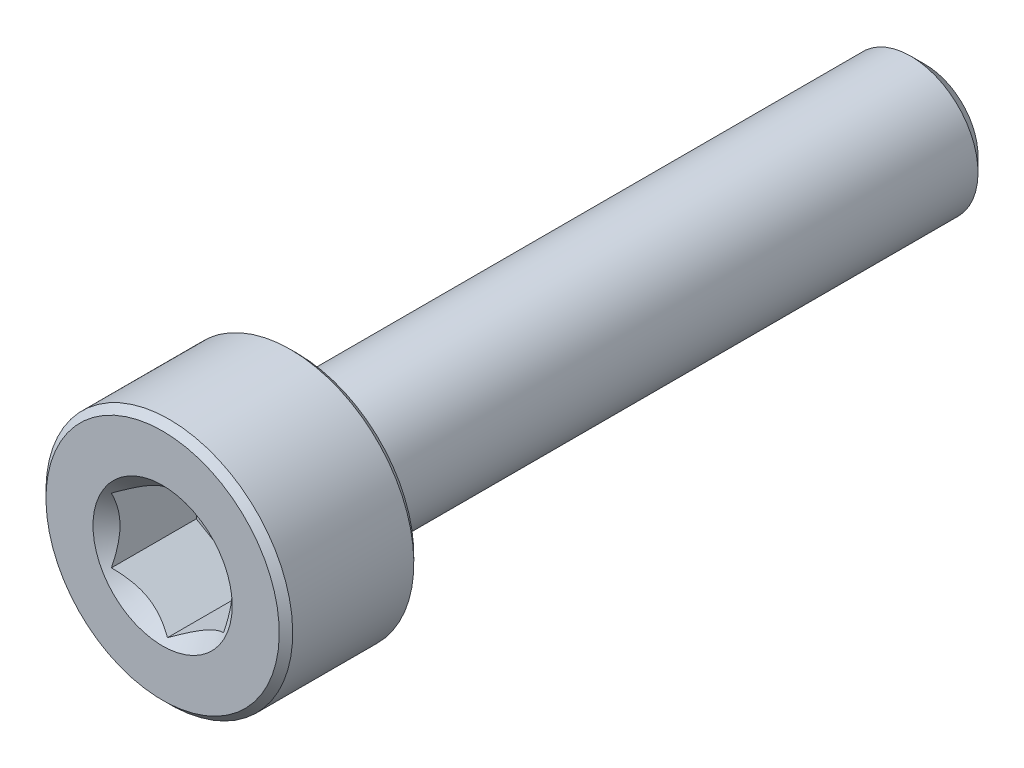
ISO-10303-21;
HEADER;
FILE_DESCRIPTION(('STEP AP214'),'2;1');
FILE_NAME('part.step','',(''),(''),'','','');
FILE_SCHEMA(('AUTOMOTIVE_DESIGN { 1 0 10303 214 1 1 1 1 }'));
ENDSEC;
DATA;
#1=APPLICATION_CONTEXT('core data for automotive mechanical design processes');
#2=APPLICATION_PROTOCOL_DEFINITION('international standard','automotive_design',2000,#1);
#3=PRODUCT_CONTEXT('',#1,'mechanical');
#4=PRODUCT('Part','Part','',(#3));
#5=PRODUCT_RELATED_PRODUCT_CATEGORY('part','',(#4));
#6=PRODUCT_DEFINITION_FORMATION('','',#4);
#7=PRODUCT_DEFINITION_CONTEXT('part definition',#1,'design');
#8=PRODUCT_DEFINITION('design','',#6,#7);
#9=PRODUCT_DEFINITION_SHAPE('','',#8);
#10=(LENGTH_UNIT() NAMED_UNIT(*) SI_UNIT(.MILLI.,.METRE.));
#11=(NAMED_UNIT(*) PLANE_ANGLE_UNIT() SI_UNIT($,.RADIAN.));
#12=(NAMED_UNIT(*) SI_UNIT($,.STERADIAN.) SOLID_ANGLE_UNIT());
#13=UNCERTAINTY_MEASURE_WITH_UNIT(LENGTH_MEASURE(1.E-05),#10,'distance_accuracy_value','');
#14=(GEOMETRIC_REPRESENTATION_CONTEXT(3) GLOBAL_UNCERTAINTY_ASSIGNED_CONTEXT((#13)) GLOBAL_UNIT_ASSIGNED_CONTEXT((#10,
#11,#12)) REPRESENTATION_CONTEXT('',''));
#15=CARTESIAN_POINT('',(0.,0.,0.));
#16=DIRECTION('',(0.,0.,1.));
#17=DIRECTION('',(1.,0.,0.));
#18=AXIS2_PLACEMENT_3D('',#15,#16,#17);
#19=CARTESIAN_POINT('',(0.,1.17524047358084,-8.5));
#20=DIRECTION('',(0.,0.,-1.));
#21=DIRECTION('',(0.,1.,0.));
#22=AXIS2_PLACEMENT_3D('',#19,#20,#21);
#23=PLANE('',#22);
#24=CARTESIAN_POINT('',(0.,0.,-8.5));
#25=DIRECTION('',(0.,0.,-1.));
#26=DIRECTION('',(0.,1.,0.));
#27=AXIS2_PLACEMENT_3D('',#24,#25,#26);
#28=CIRCLE('',#27,1.17524047358084);
#29=CARTESIAN_POINT('',(0.,1.17524047358084,-8.5));
#30=VERTEX_POINT('',#29);
#31=EDGE_CURVE('E54',#30,#30,#28,.T.);
#32=ORIENTED_EDGE('',*,*,#31,.T.);
#33=EDGE_LOOP('',(#32));
#34=FACE_BOUND('',#33,.T.);
#35=ADVANCED_FACE('F41',(#34),#23,.T.);
#36=CARTESIAN_POINT('',(0.,0.,-8.5));
#37=DIRECTION('',(0.,0.,1.));
#38=DIRECTION('',(0.,-1.,0.));
#39=AXIS2_PLACEMENT_3D('',#36,#37,#38);
#40=CONICAL_SURFACE('',#39,1.17524047358084,0.785398163397446);
#41=CARTESIAN_POINT('',(0.,0.,-8.17524047358083));
#42=DIRECTION('',(0.,0.,-1.));
#43=DIRECTION('',(0.,1.,0.));
#44=AXIS2_PLACEMENT_3D('',#41,#42,#43);
#45=CIRCLE('',#44,1.5);
#46=CARTESIAN_POINT('',(0.,1.5,-8.17524047358083));
#47=VERTEX_POINT('',#46);
#48=EDGE_CURVE('E157',#47,#47,#45,.T.);
#49=ORIENTED_EDGE('',*,*,#48,.T.);
#50=EDGE_LOOP('',(#49));
#51=FACE_BOUND('',#50,.T.);
#52=ORIENTED_EDGE('',*,*,#31,.F.);
#53=EDGE_LOOP('',(#52));
#54=FACE_BOUND('',#53,.T.);
#55=ADVANCED_FACE('F163',(#51,#54),#40,.T.);
#56=CARTESIAN_POINT('',(0.,0.,-8.5));
#57=DIRECTION('',(0.,0.,-1.));
#58=DIRECTION('',(0.,1.,0.));
#59=AXIS2_PLACEMENT_3D('',#56,#57,#58);
#60=CYLINDRICAL_SURFACE('',#59,1.5);
#61=CARTESIAN_POINT('',(0.,0.,5.35));
#62=DIRECTION('',(0.,0.,-1.));
#63=DIRECTION('',(0.,1.,0.));
#64=AXIS2_PLACEMENT_3D('',#61,#62,#63);
#65=CIRCLE('',#64,1.5);
#66=CARTESIAN_POINT('',(0.,1.5,5.35));
#67=VERTEX_POINT('',#66);
#68=EDGE_CURVE('E154',#67,#67,#65,.T.);
#69=ORIENTED_EDGE('',*,*,#68,.T.);
#70=EDGE_LOOP('',(#69));
#71=FACE_BOUND('',#70,.T.);
#72=ORIENTED_EDGE('',*,*,#48,.F.);
#73=EDGE_LOOP('',(#72));
#74=FACE_BOUND('',#73,.T.);
#75=ADVANCED_FACE('F165',(#71,#74),#60,.T.);
#76=CARTESIAN_POINT('',(0.,0.,5.35));
#77=DIRECTION('',(0.,0.,-1.));
#78=DIRECTION('',(0.,1.,0.));
#79=AXIS2_PLACEMENT_3D('',#76,#77,#78);
#80=TOROIDAL_SURFACE('',#79,1.65,0.15);
#81=CARTESIAN_POINT('',(0.,0.,5.5));
#82=DIRECTION('',(0.,0.,-1.));
#83=DIRECTION('',(0.,1.,0.));
#84=AXIS2_PLACEMENT_3D('',#81,#82,#83);
#85=CIRCLE('',#84,1.65);
#86=CARTESIAN_POINT('',(0.,1.65,5.5));
#87=VERTEX_POINT('',#86);
#88=EDGE_CURVE('E151',#87,#87,#85,.T.);
#89=ORIENTED_EDGE('',*,*,#88,.T.);
#90=EDGE_LOOP('',(#89));
#91=FACE_BOUND('',#90,.T.);
#92=ORIENTED_EDGE('',*,*,#68,.F.);
#93=EDGE_LOOP('',(#92));
#94=FACE_BOUND('',#93,.T.);
#95=ADVANCED_FACE('F171',(#91,#94),#80,.F.);
#96=CARTESIAN_POINT('',(0.,2.6,5.5));
#97=DIRECTION('',(0.,0.,-1.));
#98=DIRECTION('',(0.,1.,0.));
#99=AXIS2_PLACEMENT_3D('',#96,#97,#98);
#100=PLANE('',#99);
#101=CARTESIAN_POINT('',(0.,0.,5.5));
#102=DIRECTION('',(0.,0.,-1.));
#103=DIRECTION('',(0.,1.,0.));
#104=AXIS2_PLACEMENT_3D('',#101,#102,#103);
#105=CIRCLE('',#104,2.6);
#106=CARTESIAN_POINT('',(0.,2.6,5.5));
#107=VERTEX_POINT('',#106);
#108=EDGE_CURVE('E148',#107,#107,#105,.T.);
#109=ORIENTED_EDGE('',*,*,#108,.T.);
#110=EDGE_LOOP('',(#109));
#111=FACE_BOUND('',#110,.T.);
#112=ORIENTED_EDGE('',*,*,#88,.F.);
#113=EDGE_LOOP('',(#112));
#114=FACE_BOUND('',#113,.T.);
#115=ADVANCED_FACE('F177',(#111,#114),#100,.T.);
#116=CARTESIAN_POINT('',(0.,0.,5.5));
#117=DIRECTION('',(0.,0.,1.));
#118=DIRECTION('',(0.,-1.,0.));
#119=AXIS2_PLACEMENT_3D('',#116,#117,#118);
#120=CONICAL_SURFACE('',#119,2.6,0.785398163397451);
#121=CARTESIAN_POINT('',(0.,0.,5.65));
#122=DIRECTION('',(0.,0.,-1.));
#123=DIRECTION('',(0.,1.,0.));
#124=AXIS2_PLACEMENT_3D('',#121,#122,#123);
#125=CIRCLE('',#124,2.75);
#126=CARTESIAN_POINT('',(0.,2.75,5.65));
#127=VERTEX_POINT('',#126);
#128=EDGE_CURVE('E145',#127,#127,#125,.T.);
#129=ORIENTED_EDGE('',*,*,#128,.T.);
#130=EDGE_LOOP('',(#129));
#131=FACE_BOUND('',#130,.T.);
#132=ORIENTED_EDGE('',*,*,#108,.F.);
#133=EDGE_LOOP('',(#132));
#134=FACE_BOUND('',#133,.T.);
#135=ADVANCED_FACE('F181',(#131,#134),#120,.T.);
#136=CARTESIAN_POINT('',(0.,0.,-8.5));
#137=DIRECTION('',(0.,0.,-1.));
#138=DIRECTION('',(0.,1.,0.));
#139=AXIS2_PLACEMENT_3D('',#136,#137,#138);
#140=CYLINDRICAL_SURFACE('',#139,2.75);
#141=CARTESIAN_POINT('',(0.,0.,8.35));
#142=DIRECTION('',(0.,0.,-1.));
#143=DIRECTION('',(0.,1.,0.));
#144=AXIS2_PLACEMENT_3D('',#141,#142,#143);
#145=CIRCLE('',#144,2.75);
#146=CARTESIAN_POINT('',(0.,2.75,8.35));
#147=VERTEX_POINT('',#146);
#148=EDGE_CURVE('E142',#147,#147,#145,.T.);
#149=ORIENTED_EDGE('',*,*,#148,.T.);
#150=EDGE_LOOP('',(#149));
#151=FACE_BOUND('',#150,.T.);
#152=ORIENTED_EDGE('',*,*,#128,.F.);
#153=EDGE_LOOP('',(#152));
#154=FACE_BOUND('',#153,.T.);
#155=ADVANCED_FACE('F185',(#151,#154),#140,.T.);
#156=CARTESIAN_POINT('',(0.,0.,8.35));
#157=DIRECTION('',(0.,0.,-1.));
#158=DIRECTION('',(0.,1.,0.));
#159=AXIS2_PLACEMENT_3D('',#156,#157,#158);
#160=CONICAL_SURFACE('',#159,2.75,0.785398163397445);
#161=CARTESIAN_POINT('',(0.,0.,8.5));
#162=DIRECTION('',(0.,0.,-1.));
#163=DIRECTION('',(0.,1.,0.));
#164=AXIS2_PLACEMENT_3D('',#161,#162,#163);
#165=CIRCLE('',#164,2.6);
#166=CARTESIAN_POINT('',(0.,2.6,8.5));
#167=VERTEX_POINT('',#166);
#168=EDGE_CURVE('E139',#167,#167,#165,.T.);
#169=ORIENTED_EDGE('',*,*,#168,.T.);
#170=EDGE_LOOP('',(#169));
#171=FACE_BOUND('',#170,.T.);
#172=ORIENTED_EDGE('',*,*,#148,.F.);
#173=EDGE_LOOP('',(#172));
#174=FACE_BOUND('',#173,.T.);
#175=ADVANCED_FACE('F189',(#171,#174),#160,.T.);
#176=CARTESIAN_POINT('',(0.,0.,8.5));
#177=DIRECTION('',(0.,0.,1.));
#178=DIRECTION('',(0.,-1.,0.));
#179=AXIS2_PLACEMENT_3D('',#176,#177,#178);
#180=PLANE('',#179);
#181=CARTESIAN_POINT('',(0.,0.,8.5));
#182=DIRECTION('',(0.,0.,1.));
#183=DIRECTION('',(1.,0.,0.));
#184=AXIS2_PLACEMENT_3D('',#181,#182,#183);
#185=CIRCLE('',#184,1.55162884844712);
#186=CARTESIAN_POINT('',(1.55162884844712,0.,8.5));
#187=VERTEX_POINT('',#186);
#188=EDGE_CURVE('E113',#187,#187,#185,.T.);
#189=ORIENTED_EDGE('',*,*,#188,.F.);
#190=EDGE_LOOP('',(#189));
#191=FACE_BOUND('',#190,.T.);
#192=ORIENTED_EDGE('',*,*,#168,.F.);
#193=EDGE_LOOP('',(#192));
#194=FACE_BOUND('',#193,.T.);
#195=ADVANCED_FACE('F193',(#191,#194),#180,.T.);
#196=CARTESIAN_POINT('',(0.,0.,8.5));
#197=DIRECTION('',(0.,0.,1.));
#198=DIRECTION('',(1.,0.,0.));
#199=AXIS2_PLACEMENT_3D('',#196,#197,#198);
#200=CONICAL_SURFACE('',#199,1.55162884844712,0.78539816339745);
#201=ORIENTED_EDGE('',*,*,#188,.T.);
#202=EDGE_LOOP('',(#201));
#203=FACE_BOUND('',#202,.T.);
#204=CARTESIAN_POINT('',(-0.000199999999999042,-1.4434911430279,8.39186230843608));
#205=CARTESIAN_POINT('',(0.0427751670715875,-1.41867941875065,8.36706849258205));
#206=CARTESIAN_POINT('',(0.0864690047459489,-1.39345276980743,8.34373055894563));
#207=CARTESIAN_POINT('',(0.175565930841943,-1.34201263554194,8.30099882861148));
#208=CARTESIAN_POINT('',(0.220977498357065,-1.31579425481276,8.28162881688736));
#209=CARTESIAN_POINT('',(0.312547820935262,-1.26292610442246,8.24844730794042));
#210=CARTESIAN_POINT('',(0.358683240175887,-1.23628980770471,8.2345523835796));
#211=CARTESIAN_POINT('',(0.451970080407594,-1.18243062538508,8.21314410668758));
#212=CARTESIAN_POINT('',(0.499118649136382,-1.15520938653761,8.20561476609373));
#213=CARTESIAN_POINT('',(0.580373556887254,-1.10829684367467,8.19882132257765));
#214=CARTESIAN_POINT('',(0.614374876627943,-1.08866617256958,8.1978153836313));
#215=CARTESIAN_POINT('',(0.68231776443248,-1.04943932800611,8.19950823943827));
#216=CARTESIAN_POINT('',(0.71625931765566,-1.02984316311599,8.20220785174249));
#217=CARTESIAN_POINT('',(0.783814856457502,-0.990839954603498,8.21115575484333));
#218=CARTESIAN_POINT('',(0.817428507286777,-0.97143310424877,8.21740735042665));
#219=CARTESIAN_POINT('',(0.884094638217815,-0.932943395609904,8.23312250594085));
#220=CARTESIAN_POINT('',(0.917146871030298,-0.913860680098299,8.24258744461441));
#221=CARTESIAN_POINT('',(1.00179969160027,-0.864986351354567,8.27067821521453));
#222=CARTESIAN_POINT('',(1.05286649242964,-0.835502920149075,8.29141698197915));
#223=CARTESIAN_POINT('',(1.15300085411326,-0.777690319475908,8.33813395919842));
#224=CARTESIAN_POINT('',(1.20207431157827,-0.749357745598417,8.36409512047371));
#225=CARTESIAN_POINT('',(1.2502,-0.721572366433194,8.39186230843608));
#226=B_SPLINE_CURVE_WITH_KNOTS('',3,(#204,#205,#206,#207,#208,#209,#210,#211,#212,#213,#214,
#215,#216,#217,#218,#219,#220,#221,#222,#223,#224,#225),.UNSPECIFIED.,.F.,.F.,(4,2,2,2,2,2,2,2,
2,2,4),(0.,0.166533409618304,0.334037607289762,0.498880396489699,0.663307919240276,
0.780963963458828,0.898645970148455,1.01643764860773,1.1342799317155,1.32148652032141,
1.50809158792573),.UNSPECIFIED.);
#227=CARTESIAN_POINT('',(0.,-1.44337567297406,8.39174682452695));
#228=VERTEX_POINT('',#227);
#229=CARTESIAN_POINT('',(1.25,-0.721687836487032,8.39174682452695));
#230=VERTEX_POINT('',#229);
#231=EDGE_CURVE('E12',#228,#230,#226,.T.);
#232=ORIENTED_EDGE('',*,*,#231,.F.);
#233=CARTESIAN_POINT('',(-1.2502,-0.721572366433195,8.39186230843608));
#234=CARTESIAN_POINT('',(-1.20722483292841,-0.746384090710444,8.36706849258205));
#235=CARTESIAN_POINT('',(-1.16353099525405,-0.771610739653665,8.34373055894563));
#236=CARTESIAN_POINT('',(-1.07443406915806,-0.823050873919155,8.30099882861148));
#237=CARTESIAN_POINT('',(-1.02902250164294,-0.849269254648334,8.28162881688736));
#238=CARTESIAN_POINT('',(-0.937452179064739,-0.902137405038636,8.24844730794042));
#239=CARTESIAN_POINT('',(-0.891316759824113,-0.928773701756388,8.2345523835796));
#240=CARTESIAN_POINT('',(-0.798029919592406,-0.982632884076013,8.21314410668758));
#241=CARTESIAN_POINT('',(-0.750881350863618,-1.00985412292348,8.20561476609373));
#242=CARTESIAN_POINT('',(-0.669626443112746,-1.05676666578643,8.19882132257765));
#243=CARTESIAN_POINT('',(-0.635625123372057,-1.07639733689152,8.1978153836313));
#244=CARTESIAN_POINT('',(-0.567682235567521,-1.11562418145499,8.19950823943827));
#245=CARTESIAN_POINT('',(-0.53374068234434,-1.1352203463451,8.20220785174248));
#246=CARTESIAN_POINT('',(-0.466185143542498,-1.1742235548576,8.21115575484332));
#247=CARTESIAN_POINT('',(-0.432571492713223,-1.19363040521233,8.21740735042665));
#248=CARTESIAN_POINT('',(-0.365905361782185,-1.23212011385119,8.23312250594085));
#249=CARTESIAN_POINT('',(-0.332853128969702,-1.2512028293628,8.24258744461441));
#250=CARTESIAN_POINT('',(-0.248200308399734,-1.30007715810653,8.27067821521453));
#251=CARTESIAN_POINT('',(-0.19713350757036,-1.32956058931202,8.29141698197915));
#252=CARTESIAN_POINT('',(-0.0969991458867441,-1.38737318998519,8.33813395919842));
#253=CARTESIAN_POINT('',(-0.0479256884217298,-1.41570576386268,8.36409512047371));
#254=CARTESIAN_POINT('',(0.000200000000000625,-1.4434911430279,8.39186230843608));
#255=B_SPLINE_CURVE_WITH_KNOTS('',3,(#233,#234,#235,#236,#237,#238,#239,#240,#241,#242,#243,
#244,#245,#246,#247,#248,#249,#250,#251,#252,#253,#254),.UNSPECIFIED.,.F.,.F.,(4,2,2,2,2,2,2,2,
2,2,4),(0.,0.166533409618304,0.334037607289762,0.498880396489699,0.663307919240276,
0.780963963458829,0.898645970148455,1.01643764860773,1.1342799317155,1.32148652032141,
1.50809158792574),.UNSPECIFIED.);
#256=CARTESIAN_POINT('',(-1.25,-0.721687836487032,8.39174682452695));
#257=VERTEX_POINT('',#256);
#258=EDGE_CURVE('E99',#257,#228,#255,.T.);
#259=ORIENTED_EDGE('',*,*,#258,.F.);
#260=CARTESIAN_POINT('',(-1.25,-1.52022146239345,8.91651070319084));
#261=CARTESIAN_POINT('',(-1.25,-1.48354689134962,8.88818689718723));
#262=CARTESIAN_POINT('',(-1.25,-1.44667707589305,8.86011672093047));
#263=CARTESIAN_POINT('',(-1.25,-1.37246477804769,8.80459065501776));
#264=CARTESIAN_POINT('',(-1.25,-1.33512218721453,8.77713491044788));
#265=CARTESIAN_POINT('',(-1.25,-1.22171630832114,8.6954580977105));
#266=CARTESIAN_POINT('',(-1.25,-1.14482995781092,8.6423614251193));
#267=CARTESIAN_POINT('',(-1.25,-0.983056768942586,8.53734973416941));
#268=CARTESIAN_POINT('',(-1.25,-0.897974111811055,8.48573326925832));
#269=CARTESIAN_POINT('',(-1.25,-0.723462355215555,8.39078355108508));
#270=CARTESIAN_POINT('',(-1.25,-0.634049271919705,8.34742232185916));
#271=CARTESIAN_POINT('',(-1.25,-0.500588771143699,8.29435177040724));
#272=CARTESIAN_POINT('',(-1.25,-0.45869172620811,8.27926501327173));
#273=CARTESIAN_POINT('',(-1.25,-0.373815329706778,8.25244749770266));
#274=CARTESIAN_POINT('',(-1.25,-0.330835910419723,8.24071694982871));
#275=CARTESIAN_POINT('',(-1.25,-0.244810833071148,8.22144313304601));
#276=CARTESIAN_POINT('',(-1.25,-0.20178270746757,8.21382289169454));
#277=CARTESIAN_POINT('',(-1.25,-0.115176247984995,8.20293190707963));
#278=CARTESIAN_POINT('',(-1.25,-0.0715980347745597,8.1996602260857));
#279=CARTESIAN_POINT('',(-1.25,0.0136806197531965,8.19775210045869));
#280=CARTESIAN_POINT('',(-1.25,0.0553765370047047,8.19891205716704));
#281=CARTESIAN_POINT('',(-1.25,0.13844909645316,8.20533266388464));
#282=CARTESIAN_POINT('',(-1.25,0.179825709781942,8.21059368038276));
#283=CARTESIAN_POINT('',(-1.25,0.262662840763598,8.22500574721218));
#284=CARTESIAN_POINT('',(-1.25,0.304111120669651,8.23422600730023));
#285=CARTESIAN_POINT('',(-1.25,0.386089884230834,8.25604235623938));
#286=CARTESIAN_POINT('',(-1.25,0.426620414510369,8.26863827317792));
#287=CARTESIAN_POINT('',(-1.25,0.550794781768361,8.31205959164791));
#288=CARTESIAN_POINT('',(-1.25,0.632755591043411,8.34768282700966));
#289=CARTESIAN_POINT('',(-1.25,0.792852508946382,8.42696814455953));
#290=CARTESIAN_POINT('',(-1.25,0.870973935410875,8.47065844211049));
#291=CARTESIAN_POINT('',(-1.25,1.02031328199646,8.56088158787621));
#292=CARTESIAN_POINT('',(-1.25,1.09168171050215,8.60716845879521));
#293=CARTESIAN_POINT('',(-1.25,1.19682802849917,8.67876149953673));
#294=CARTESIAN_POINT('',(-1.25,1.23142482143589,8.70288582787532));
#295=CARTESIAN_POINT('',(-1.25,1.30014350643268,8.75178258410313));
#296=CARTESIAN_POINT('',(-1.25,1.33426552680451,8.7765548314612));
#297=CARTESIAN_POINT('',(-1.25,1.36818950249276,8.8015960474388));
#298=B_SPLINE_CURVE_WITH_KNOTS('',3,(#260,#261,#262,#263,#264,#265,#266,#267,#268,#269,#270,
#271,#272,#273,#274,#275,#276,#277,#278,#279,#280,#281,#282,#283,#284,#285,#286,#287,#288,#289,
#290,#291,#292,#293,#294,#295,#296,#297),.UNSPECIFIED.,.F.,.F.,(4,2,2,2,2,2,2,2,2,2,2,2,2,2,2,2,
2,2,4),(0.,0.139012369615044,0.278057225136918,0.558259504053771,0.856585057342474,
1.15388088887299,1.28736138903992,1.42085026158167,1.55174393609413,1.68260937990424,
1.80753647715252,1.93247473971975,2.05969207441603,2.18690293152764,2.45422704655832,
2.72250450232039,2.97756898823762,3.10409578574714,3.23058769667827),.UNSPECIFIED.);
#299=CARTESIAN_POINT('',(-1.25,0.721687836487032,8.39174682452695));
#300=VERTEX_POINT('',#299);
#301=EDGE_CURVE('E112',#300,#257,#298,.F.);
#302=ORIENTED_EDGE('',*,*,#301,.F.);
#303=CARTESIAN_POINT('',(0.000199999999999644,1.4434911430279,8.39186230843608));
#304=CARTESIAN_POINT('',(-0.0427751670715867,1.41867941875065,8.36706849258205));
#305=CARTESIAN_POINT('',(-0.0864690047459477,1.39345276980743,8.34373055894563));
#306=CARTESIAN_POINT('',(-0.175565930841941,1.34201263554194,8.30099882861148));
#307=CARTESIAN_POINT('',(-0.220977498357063,1.31579425481276,8.28162881688736));
#308=CARTESIAN_POINT('',(-0.312547820935258,1.26292610442246,8.24844730794042));
#309=CARTESIAN_POINT('',(-0.358683240175884,1.23628980770471,8.2345523835796));
#310=CARTESIAN_POINT('',(-0.451970080407591,1.18243062538509,8.21314410668758));
#311=CARTESIAN_POINT('',(-0.499118649136378,1.15520938653761,8.20561476609373));
#312=CARTESIAN_POINT('',(-0.58037355688725,1.10829684367467,8.19882132257765));
#313=CARTESIAN_POINT('',(-0.614374876627939,1.08866617256958,8.1978153836313));
#314=CARTESIAN_POINT('',(-0.682317764432475,1.04943932800611,8.19950823943827));
#315=CARTESIAN_POINT('',(-0.716259317655655,1.02984316311599,8.20220785174248));
#316=CARTESIAN_POINT('',(-0.783814856457497,0.9908399546035,8.21115575484332));
#317=CARTESIAN_POINT('',(-0.817428507286773,0.971433104248772,8.21740735042665));
#318=CARTESIAN_POINT('',(-0.884094638217811,0.932943395609906,8.23312250594085));
#319=CARTESIAN_POINT('',(-0.917146871030293,0.913860680098302,8.2425874446144));
#320=CARTESIAN_POINT('',(-1.00179969160026,0.864986351354569,8.27067821521453));
#321=CARTESIAN_POINT('',(-1.05286649242964,0.835502920149077,8.29141698197915));
#322=CARTESIAN_POINT('',(-1.15300085411325,0.777690319475909,8.33813395919842));
#323=CARTESIAN_POINT('',(-1.20207431157827,0.749357745598417,8.36409512047371));
#324=CARTESIAN_POINT('',(-1.2502,0.721572366433194,8.39186230843608));
#325=B_SPLINE_CURVE_WITH_KNOTS('',3,(#303,#304,#305,#306,#307,#308,#309,#310,#311,#312,#313,
#314,#315,#316,#317,#318,#319,#320,#321,#322,#323,#324),.UNSPECIFIED.,.F.,.F.,(4,2,2,2,2,2,2,2,
2,2,4),(0.,0.166533409618303,0.33403760728976,0.498880396489696,0.663307919240272,
0.780963963458824,0.89864597014845,1.01643764860773,1.13427993171549,1.3214865203214,
1.50809158792573),.UNSPECIFIED.);
#326=CARTESIAN_POINT('',(0.,1.44337567297406,8.39174682452695));
#327=VERTEX_POINT('',#326);
#328=EDGE_CURVE('E243',#327,#300,#325,.T.);
#329=ORIENTED_EDGE('',*,*,#328,.F.);
#330=CARTESIAN_POINT('',(1.2502,0.721572366433194,8.39186230843608));
#331=CARTESIAN_POINT('',(1.20722483292841,0.746384090710444,8.36706849258205));
#332=CARTESIAN_POINT('',(1.16353099525405,0.771610739653664,8.34373055894563));
#333=CARTESIAN_POINT('',(1.07443406915806,0.823050873919154,8.30099882861148));
#334=CARTESIAN_POINT('',(1.02902250164294,0.849269254648332,8.28162881688736));
#335=CARTESIAN_POINT('',(0.937452179064742,0.902137405038634,8.24844730794042));
#336=CARTESIAN_POINT('',(0.891316759824116,0.928773701756386,8.2345523835796));
#337=CARTESIAN_POINT('',(0.79802991959241,0.982632884076011,8.21314410668758));
#338=CARTESIAN_POINT('',(0.750881350863623,1.00985412292348,8.20561476609373));
#339=CARTESIAN_POINT('',(0.66962644311275,1.05676666578643,8.19882132257765));
#340=CARTESIAN_POINT('',(0.635625123372062,1.07639733689152,8.1978153836313));
#341=CARTESIAN_POINT('',(0.567682235567525,1.11562418145499,8.19950823943827));
#342=CARTESIAN_POINT('',(0.533740682344345,1.1352203463451,8.20220785174248));
#343=CARTESIAN_POINT('',(0.466185143542503,1.1742235548576,8.21115575484332));
#344=CARTESIAN_POINT('',(0.432571492713228,1.19363040521232,8.21740735042665));
#345=CARTESIAN_POINT('',(0.36590536178219,1.23212011385119,8.23312250594085));
#346=CARTESIAN_POINT('',(0.332853128969707,1.25120282936279,8.2425874446144));
#347=CARTESIAN_POINT('',(0.248200308399738,1.30007715810653,8.27067821521453));
#348=CARTESIAN_POINT('',(0.197133507570364,1.32956058931202,8.29141698197915));
#349=CARTESIAN_POINT('',(0.096999145886746,1.38737318998519,8.33813395919842));
#350=CARTESIAN_POINT('',(0.0479256884217307,1.41570576386268,8.36409512047371));
#351=CARTESIAN_POINT('',(-0.000200000000000498,1.4434911430279,8.39186230843608));
#352=B_SPLINE_CURVE_WITH_KNOTS('',3,(#330,#331,#332,#333,#334,#335,#336,#337,#338,#339,#340,
#341,#342,#343,#344,#345,#346,#347,#348,#349,#350,#351),.UNSPECIFIED.,.F.,.F.,(4,2,2,2,2,2,2,2,
2,2,4),(0.,0.166533409618303,0.33403760728976,0.498880396489696,0.663307919240271,
0.780963963458823,0.898645970148449,1.01643764860773,1.13427993171549,1.32148652032141,
1.50809158792574),.UNSPECIFIED.);
#353=CARTESIAN_POINT('',(1.25,0.721687836487032,8.39174682452695));
#354=VERTEX_POINT('',#353);
#355=EDGE_CURVE('E216',#354,#327,#352,.T.);
#356=ORIENTED_EDGE('',*,*,#355,.F.);
#357=CARTESIAN_POINT('',(1.25,-1.52022146239345,8.91651070319084));
#358=CARTESIAN_POINT('',(1.25,-1.48354689134962,8.88818689718723));
#359=CARTESIAN_POINT('',(1.25,-1.44667707589305,8.86011672093047));
#360=CARTESIAN_POINT('',(1.25,-1.37246477804769,8.80459065501776));
#361=CARTESIAN_POINT('',(1.25,-1.33512218721453,8.77713491044788));
#362=CARTESIAN_POINT('',(1.25,-1.22171630832114,8.6954580977105));
#363=CARTESIAN_POINT('',(1.25,-1.14482995781092,8.6423614251193));
#364=CARTESIAN_POINT('',(1.25,-0.983056768942586,8.53734973416941));
#365=CARTESIAN_POINT('',(1.25,-0.897974111811056,8.48573326925832));
#366=CARTESIAN_POINT('',(1.25,-0.723462355215556,8.39078355108508));
#367=CARTESIAN_POINT('',(1.25,-0.634049271919706,8.34742232185916));
#368=CARTESIAN_POINT('',(1.25,-0.5005887711437,8.29435177040724));
#369=CARTESIAN_POINT('',(1.25,-0.45869172620811,8.27926501327173));
#370=CARTESIAN_POINT('',(1.25,-0.373815329706779,8.25244749770266));
#371=CARTESIAN_POINT('',(1.25,-0.330835910419723,8.24071694982871));
#372=CARTESIAN_POINT('',(1.25,-0.244810833071149,8.22144313304601));
#373=CARTESIAN_POINT('',(1.25,-0.20178270746757,8.21382289169454));
#374=CARTESIAN_POINT('',(1.25,-0.115176247984995,8.20293190707963));
#375=CARTESIAN_POINT('',(1.25,-0.0715980347745604,8.1996602260857));
#376=CARTESIAN_POINT('',(1.25,0.0136806197531958,8.19775210045869));
#377=CARTESIAN_POINT('',(1.25,0.055376537004704,8.19891205716704));
#378=CARTESIAN_POINT('',(1.25,0.138449096453159,8.20533266388464));
#379=CARTESIAN_POINT('',(1.25,0.179825709781941,8.21059368038276));
#380=CARTESIAN_POINT('',(1.25,0.262662840763598,8.22500574721218));
#381=CARTESIAN_POINT('',(1.25,0.304111120669651,8.23422600730023));
#382=CARTESIAN_POINT('',(1.25,0.386089884230834,8.25604235623938));
#383=CARTESIAN_POINT('',(1.25,0.426620414510368,8.26863827317792));
#384=CARTESIAN_POINT('',(1.25,0.550794781768361,8.31205959164791));
#385=CARTESIAN_POINT('',(1.25,0.632755591043411,8.34768282700966));
#386=CARTESIAN_POINT('',(1.25,0.792852508946381,8.42696814455953));
#387=CARTESIAN_POINT('',(1.25,0.870973935410875,8.47065844211049));
#388=CARTESIAN_POINT('',(1.25,1.02031328199646,8.56088158787621));
#389=CARTESIAN_POINT('',(1.25,1.09168171050215,8.60716845879521));
#390=CARTESIAN_POINT('',(1.25,1.19682802849918,8.67876149953674));
#391=CARTESIAN_POINT('',(1.25,1.2314248214359,8.70288582787532));
#392=CARTESIAN_POINT('',(1.25,1.30014350643268,8.75178258410313));
#393=CARTESIAN_POINT('',(1.25,1.33426552680451,8.7765548314612));
#394=CARTESIAN_POINT('',(1.25,1.36818950249276,8.8015960474388));
#395=B_SPLINE_CURVE_WITH_KNOTS('',3,(#357,#358,#359,#360,#361,#362,#363,#364,#365,#366,#367,
#368,#369,#370,#371,#372,#373,#374,#375,#376,#377,#378,#379,#380,#381,#382,#383,#384,#385,#386,
#387,#388,#389,#390,#391,#392,#393,#394),.UNSPECIFIED.,.F.,.F.,(4,2,2,2,2,2,2,2,2,2,2,2,2,2,2,2,
2,2,4),(0.,0.139012369615044,0.278057225136917,0.55825950405377,0.856585057342473,
1.15388088887298,1.28736138903992,1.42085026158167,1.55174393609413,1.68260937990424,
1.80753647715252,1.93247473971975,2.05969207441603,2.18690293152764,2.45422704655832,
2.72250450232038,2.97756898823762,3.10409578574714,3.23058769667827),.UNSPECIFIED.);
#396=EDGE_CURVE('E61',#230,#354,#395,.T.);
#397=ORIENTED_EDGE('',*,*,#396,.F.);
#398=EDGE_LOOP('',(#232,#259,#302,#329,#356,#397));
#399=FACE_BOUND('',#398,.T.);
#400=ADVANCED_FACE('F98',(#203,#399),#200,.F.);
#401=CARTESIAN_POINT('',(0.,2.6,6.5));
#402=DIRECTION('',(0.,0.,-1.));
#403=DIRECTION('',(0.,1.,0.));
#404=AXIS2_PLACEMENT_3D('',#401,#402,#403);
#405=PLANE('',#404);
#406=DIRECTION('',(0.866025403784438,0.5,0.));
#407=VECTOR('',#406,1.);
#408=CARTESIAN_POINT('',(0.,-1.44337567297406,6.5));
#409=LINE('',#408,#407);
#410=CARTESIAN_POINT('',(0.,-1.44337567297406,6.5));
#411=VERTEX_POINT('',#410);
#412=CARTESIAN_POINT('',(1.25,-0.721687836487032,6.5));
#413=VERTEX_POINT('',#412);
#414=EDGE_CURVE('E116',#411,#413,#409,.T.);
#415=ORIENTED_EDGE('',*,*,#414,.T.);
#416=DIRECTION('',(0.,1.,0.));
#417=VECTOR('',#416,1.);
#418=CARTESIAN_POINT('',(1.25,-0.721687836487032,6.5));
#419=LINE('',#418,#417);
#420=CARTESIAN_POINT('',(1.25,0.721687836487032,6.5));
#421=VERTEX_POINT('',#420);
#422=EDGE_CURVE('E68',#413,#421,#419,.T.);
#423=ORIENTED_EDGE('',*,*,#422,.T.);
#424=DIRECTION('',(-0.866025403784439,0.5,0.));
#425=VECTOR('',#424,1.);
#426=CARTESIAN_POINT('',(1.25,0.721687836487032,6.5));
#427=LINE('',#426,#425);
#428=CARTESIAN_POINT('',(0.,1.44337567297406,6.5));
#429=VERTEX_POINT('',#428);
#430=EDGE_CURVE('E124',#421,#429,#427,.T.);
#431=ORIENTED_EDGE('',*,*,#430,.T.);
#432=DIRECTION('',(-0.866025403784439,-0.5,0.));
#433=VECTOR('',#432,1.);
#434=CARTESIAN_POINT('',(0.,1.44337567297406,6.5));
#435=LINE('',#434,#433);
#436=CARTESIAN_POINT('',(-1.25,0.721687836487032,6.5));
#437=VERTEX_POINT('',#436);
#438=EDGE_CURVE('E131',#429,#437,#435,.T.);
#439=ORIENTED_EDGE('',*,*,#438,.T.);
#440=DIRECTION('',(0.,-1.,0.));
#441=VECTOR('',#440,1.);
#442=CARTESIAN_POINT('',(-1.25,0.721687836487032,6.5));
#443=LINE('',#442,#441);
#444=CARTESIAN_POINT('',(-1.25,-0.721687836487033,6.5));
#445=VERTEX_POINT('',#444);
#446=EDGE_CURVE('E127',#437,#445,#443,.T.);
#447=ORIENTED_EDGE('',*,*,#446,.T.);
#448=DIRECTION('',(0.866025403784439,-0.5,0.));
#449=VECTOR('',#448,1.);
#450=CARTESIAN_POINT('',(-1.25,-0.721687836487032,6.5));
#451=LINE('',#450,#449);
#452=EDGE_CURVE('E117',#445,#411,#451,.T.);
#453=ORIENTED_EDGE('',*,*,#452,.T.);
#454=EDGE_LOOP('',(#415,#423,#431,#439,#447,#453));
#455=FACE_BOUND('',#454,.T.);
#456=ADVANCED_FACE('F198',(#455),#405,.F.);
#457=CARTESIAN_POINT('',(0.,-1.44337567297406,1.68118692087013));
#458=DIRECTION('',(0.5,-0.866025403784438,0.));
#459=DIRECTION('',(0.866025403784438,0.5,0.));
#460=AXIS2_PLACEMENT_3D('',#457,#458,#459);
#461=PLANE('',#460);
#462=DIRECTION('',(0.,0.,1.));
#463=VECTOR('',#462,1.);
#464=CARTESIAN_POINT('',(0.,-1.44337567297406,1.68118692087013));
#465=LINE('',#464,#463);
#466=EDGE_CURVE('E108',#411,#228,#465,.T.);
#467=ORIENTED_EDGE('',*,*,#466,.T.);
#468=ORIENTED_EDGE('',*,*,#231,.T.);
#469=DIRECTION('',(0.,0.,1.));
#470=VECTOR('',#469,1.);
#471=CARTESIAN_POINT('',(1.25,-0.721687836487032,1.68118692087013));
#472=LINE('',#471,#470);
#473=EDGE_CURVE('E119',#413,#230,#472,.T.);
#474=ORIENTED_EDGE('',*,*,#473,.F.);
#475=ORIENTED_EDGE('',*,*,#414,.F.);
#476=EDGE_LOOP('',(#467,#468,#474,#475));
#477=FACE_BOUND('',#476,.T.);
#478=ADVANCED_FACE('F115',(#477),#461,.F.);
#479=CARTESIAN_POINT('',(-1.25,-0.721687836487032,1.68118692087013));
#480=DIRECTION('',(-0.5,-0.866025403784439,0.));
#481=DIRECTION('',(0.866025403784439,-0.5,0.));
#482=AXIS2_PLACEMENT_3D('',#479,#480,#481);
#483=PLANE('',#482);
#484=DIRECTION('',(0.,0.,1.));
#485=VECTOR('',#484,1.);
#486=CARTESIAN_POINT('',(-1.25,-0.721687836487032,1.68118692087013));
#487=LINE('',#486,#485);
#488=EDGE_CURVE('E111',#445,#257,#487,.T.);
#489=ORIENTED_EDGE('',*,*,#488,.T.);
#490=ORIENTED_EDGE('',*,*,#258,.T.);
#491=ORIENTED_EDGE('',*,*,#466,.F.);
#492=ORIENTED_EDGE('',*,*,#452,.F.);
#493=EDGE_LOOP('',(#489,#490,#491,#492));
#494=FACE_BOUND('',#493,.T.);
#495=ADVANCED_FACE('F107',(#494),#483,.F.);
#496=CARTESIAN_POINT('',(-1.25,0.721687836487032,1.68118692087013));
#497=DIRECTION('',(-1.,0.,0.));
#498=DIRECTION('',(0.,0.,1.));
#499=AXIS2_PLACEMENT_3D('',#496,#497,#498);
#500=PLANE('',#499);
#501=DIRECTION('',(0.,0.,1.));
#502=VECTOR('',#501,1.);
#503=CARTESIAN_POINT('',(-1.25,0.721687836487032,1.68118692087013));
#504=LINE('',#503,#502);
#505=EDGE_CURVE('E128',#437,#300,#504,.T.);
#506=ORIENTED_EDGE('',*,*,#505,.T.);
#507=ORIENTED_EDGE('',*,*,#301,.T.);
#508=ORIENTED_EDGE('',*,*,#488,.F.);
#509=ORIENTED_EDGE('',*,*,#446,.F.);
#510=EDGE_LOOP('',(#506,#507,#508,#509));
#511=FACE_BOUND('',#510,.T.);
#512=ADVANCED_FACE('F252',(#511),#500,.F.);
#513=CARTESIAN_POINT('',(0.,1.44337567297406,1.68118692087013));
#514=DIRECTION('',(-0.5,0.866025403784438,0.));
#515=DIRECTION('',(-0.866025403784439,-0.5,0.));
#516=AXIS2_PLACEMENT_3D('',#513,#514,#515);
#517=PLANE('',#516);
#518=DIRECTION('',(0.,0.,1.));
#519=VECTOR('',#518,1.);
#520=CARTESIAN_POINT('',(0.,1.44337567297406,1.68118692087013));
#521=LINE('',#520,#519);
#522=EDGE_CURVE('E132',#429,#327,#521,.T.);
#523=ORIENTED_EDGE('',*,*,#522,.T.);
#524=ORIENTED_EDGE('',*,*,#328,.T.);
#525=ORIENTED_EDGE('',*,*,#505,.F.);
#526=ORIENTED_EDGE('',*,*,#438,.F.);
#527=EDGE_LOOP('',(#523,#524,#525,#526));
#528=FACE_BOUND('',#527,.T.);
#529=ADVANCED_FACE('F249',(#528),#517,.F.);
#530=CARTESIAN_POINT('',(1.25,0.721687836487032,1.68118692087013));
#531=DIRECTION('',(0.5,0.866025403784439,0.));
#532=DIRECTION('',(-0.866025403784439,0.5,0.));
#533=AXIS2_PLACEMENT_3D('',#530,#531,#532);
#534=PLANE('',#533);
#535=DIRECTION('',(0.,0.,1.));
#536=VECTOR('',#535,1.);
#537=CARTESIAN_POINT('',(1.25,0.721687836487032,1.68118692087013));
#538=LINE('',#537,#536);
#539=EDGE_CURVE('E135',#421,#354,#538,.T.);
#540=ORIENTED_EDGE('',*,*,#539,.T.);
#541=ORIENTED_EDGE('',*,*,#355,.T.);
#542=ORIENTED_EDGE('',*,*,#522,.F.);
#543=ORIENTED_EDGE('',*,*,#430,.F.);
#544=EDGE_LOOP('',(#540,#541,#542,#543));
#545=FACE_BOUND('',#544,.T.);
#546=ADVANCED_FACE('F206',(#545),#534,.F.);
#547=CARTESIAN_POINT('',(1.25,-0.721687836487032,1.68118692087013));
#548=DIRECTION('',(1.,0.,0.));
#549=DIRECTION('',(0.,0.,-1.));
#550=AXIS2_PLACEMENT_3D('',#547,#548,#549);
#551=PLANE('',#550);
#552=ORIENTED_EDGE('',*,*,#473,.T.);
#553=ORIENTED_EDGE('',*,*,#396,.T.);
#554=ORIENTED_EDGE('',*,*,#539,.F.);
#555=ORIENTED_EDGE('',*,*,#422,.F.);
#556=EDGE_LOOP('',(#552,#553,#554,#555));
#557=FACE_BOUND('',#556,.T.);
#558=ADVANCED_FACE('F202',(#557),#551,.F.);
#559=CLOSED_SHELL('',(#35,#55,#75,#95,#115,#135,#155,#175,#195,#400,#456,#478,#495,#512,#529,
#546,#558));
#560=MANIFOLD_SOLID_BREP('B2',#559);
#561=ADVANCED_BREP_SHAPE_REPRESENTATION('',(#18,#560),#14);
#562=SHAPE_DEFINITION_REPRESENTATION(#9,#561);
ENDSEC;
END-ISO-10303-21;
